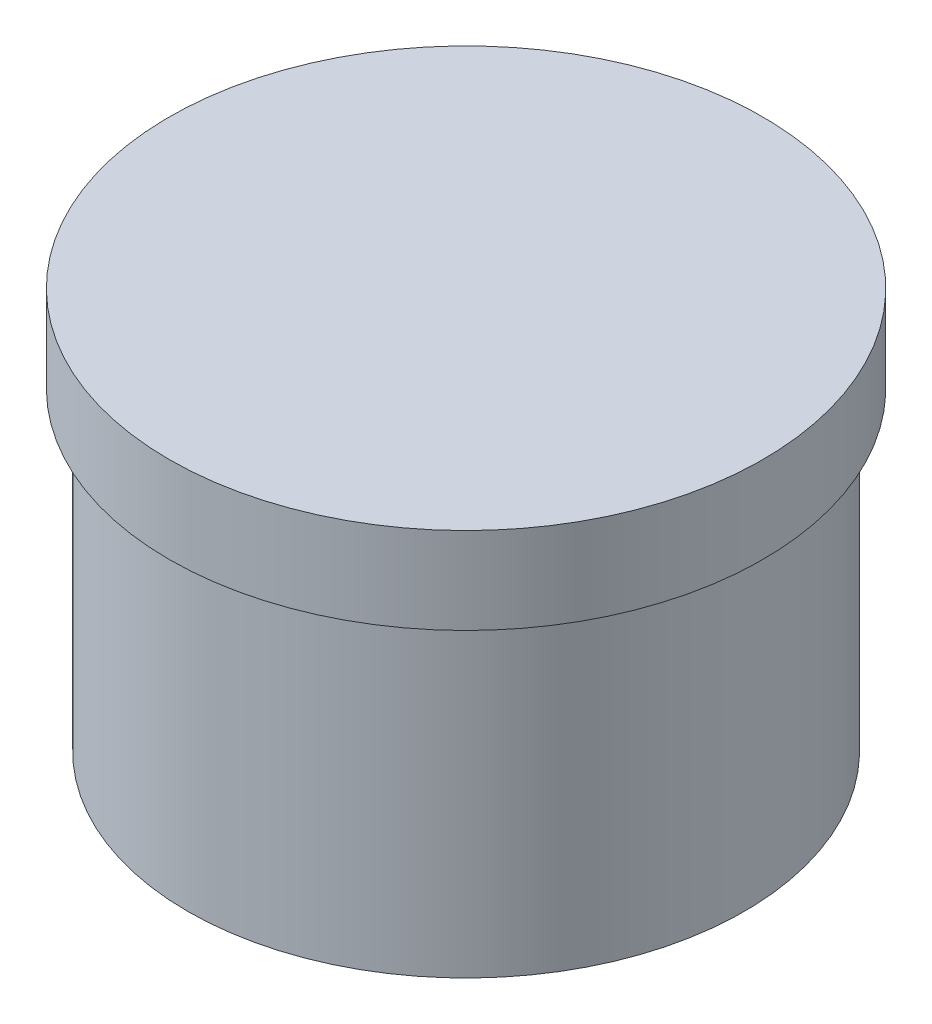
ISO-10303-21;
HEADER;
FILE_DESCRIPTION(('STEP AP214'),'2;1');
FILE_NAME('part.step','',(''),(''),'','','');
FILE_SCHEMA(('AUTOMOTIVE_DESIGN { 1 0 10303 214 1 1 1 1 }'));
ENDSEC;
DATA;
#1=APPLICATION_CONTEXT('core data for automotive mechanical design processes');
#2=APPLICATION_PROTOCOL_DEFINITION('international standard','automotive_design',2000,#1);
#3=PRODUCT_CONTEXT('',#1,'mechanical');
#4=PRODUCT('Part','Part','',(#3));
#5=PRODUCT_RELATED_PRODUCT_CATEGORY('part','',(#4));
#6=PRODUCT_DEFINITION_FORMATION('','',#4);
#7=PRODUCT_DEFINITION_CONTEXT('part definition',#1,'design');
#8=PRODUCT_DEFINITION('design','',#6,#7);
#9=PRODUCT_DEFINITION_SHAPE('','',#8);
#10=(LENGTH_UNIT() NAMED_UNIT(*) SI_UNIT(.MILLI.,.METRE.));
#11=(NAMED_UNIT(*) PLANE_ANGLE_UNIT() SI_UNIT($,.RADIAN.));
#12=(NAMED_UNIT(*) SI_UNIT($,.STERADIAN.) SOLID_ANGLE_UNIT());
#13=UNCERTAINTY_MEASURE_WITH_UNIT(LENGTH_MEASURE(1.E-05),#10,'distance_accuracy_value','');
#14=(GEOMETRIC_REPRESENTATION_CONTEXT(3) GLOBAL_UNCERTAINTY_ASSIGNED_CONTEXT((#13)) GLOBAL_UNIT_ASSIGNED_CONTEXT((#10,
#11,#12)) REPRESENTATION_CONTEXT('',''));
#15=CARTESIAN_POINT('',(0.,0.,0.));
#16=DIRECTION('',(0.,0.,1.));
#17=DIRECTION('',(1.,0.,0.));
#18=AXIS2_PLACEMENT_3D('',#15,#16,#17);
#19=CARTESIAN_POINT('',(0.,-25.4,0.));
#20=DIRECTION('',(0.,1.,0.));
#21=DIRECTION('',(0.,0.,1.));
#22=AXIS2_PLACEMENT_3D('',#19,#20,#21);
#23=CYLINDRICAL_SURFACE('',#22,22.5);
#24=CARTESIAN_POINT('',(0.,-25.4,0.));
#25=DIRECTION('',(0.,1.,0.));
#26=DIRECTION('',(0.,0.,1.));
#27=AXIS2_PLACEMENT_3D('',#24,#25,#26);
#28=CIRCLE('',#27,22.5);
#29=CARTESIAN_POINT('',(0.,-25.4,22.5));
#30=VERTEX_POINT('',#29);
#31=EDGE_CURVE('E10',#30,#30,#28,.T.);
#32=ORIENTED_EDGE('',*,*,#31,.T.);
#33=EDGE_LOOP('',(#32));
#34=FACE_BOUND('',#33,.T.);
#35=CARTESIAN_POINT('',(0.,0.,0.));
#36=DIRECTION('',(0.,1.,0.));
#37=DIRECTION('',(0.,0.,1.));
#38=AXIS2_PLACEMENT_3D('',#35,#36,#37);
#39=CIRCLE('',#38,22.5);
#40=CARTESIAN_POINT('',(0.,0.,22.5));
#41=VERTEX_POINT('',#40);
#42=EDGE_CURVE('E34',#41,#41,#39,.T.);
#43=ORIENTED_EDGE('',*,*,#42,.F.);
#44=EDGE_LOOP('',(#43));
#45=FACE_BOUND('',#44,.T.);
#46=ADVANCED_FACE('F31',(#34,#45),#23,.T.);
#47=CARTESIAN_POINT('',(0.,-25.4,0.));
#48=DIRECTION('',(0.,1.,0.));
#49=DIRECTION('',(0.,0.,1.));
#50=AXIS2_PLACEMENT_3D('',#47,#48,#49);
#51=PLANE('',#50);
#52=ORIENTED_EDGE('',*,*,#31,.F.);
#53=EDGE_LOOP('',(#52));
#54=FACE_BOUND('',#53,.T.);
#55=ADVANCED_FACE('F54',(#54),#51,.F.);
#56=CARTESIAN_POINT('',(0.,7.,0.));
#57=DIRECTION('',(0.,-1.,0.));
#58=DIRECTION('',(0.,0.,-1.));
#59=AXIS2_PLACEMENT_3D('',#56,#57,#58);
#60=CYLINDRICAL_SURFACE('',#59,24.);
#61=CARTESIAN_POINT('',(0.,7.,0.));
#62=DIRECTION('',(0.,1.,0.));
#63=DIRECTION('',(0.,0.,1.));
#64=AXIS2_PLACEMENT_3D('',#61,#62,#63);
#65=CIRCLE('',#64,24.);
#66=CARTESIAN_POINT('',(0.,7.,24.));
#67=VERTEX_POINT('',#66);
#68=EDGE_CURVE('E41',#67,#67,#65,.T.);
#69=ORIENTED_EDGE('',*,*,#68,.F.);
#70=EDGE_LOOP('',(#69));
#71=FACE_BOUND('',#70,.T.);
#72=CARTESIAN_POINT('',(0.,0.,0.));
#73=DIRECTION('',(0.,1.,0.));
#74=DIRECTION('',(0.,0.,1.));
#75=AXIS2_PLACEMENT_3D('',#72,#73,#74);
#76=CIRCLE('',#75,24.);
#77=CARTESIAN_POINT('',(0.,0.,24.));
#78=VERTEX_POINT('',#77);
#79=EDGE_CURVE('E43',#78,#78,#76,.T.);
#80=ORIENTED_EDGE('',*,*,#79,.T.);
#81=EDGE_LOOP('',(#80));
#82=FACE_BOUND('',#81,.T.);
#83=ADVANCED_FACE('F51',(#71,#82),#60,.T.);
#84=CARTESIAN_POINT('',(0.,7.,0.));
#85=DIRECTION('',(0.,1.,0.));
#86=DIRECTION('',(0.,0.,1.));
#87=AXIS2_PLACEMENT_3D('',#84,#85,#86);
#88=PLANE('',#87);
#89=ORIENTED_EDGE('',*,*,#68,.T.);
#90=EDGE_LOOP('',(#89));
#91=FACE_BOUND('',#90,.T.);
#92=ADVANCED_FACE('F49',(#91),#88,.T.);
#93=CARTESIAN_POINT('',(0.,0.,0.));
#94=DIRECTION('',(0.,1.,0.));
#95=DIRECTION('',(0.,0.,1.));
#96=AXIS2_PLACEMENT_3D('',#93,#94,#95);
#97=PLANE('',#96);
#98=ORIENTED_EDGE('',*,*,#42,.T.);
#99=EDGE_LOOP('',(#98));
#100=FACE_BOUND('',#99,.T.);
#101=ORIENTED_EDGE('',*,*,#79,.F.);
#102=EDGE_LOOP('',(#101));
#103=FACE_BOUND('',#102,.T.);
#104=ADVANCED_FACE('F58',(#100,#103),#97,.F.);
#105=CLOSED_SHELL('',(#46,#55,#83,#92,#104));
#106=MANIFOLD_SOLID_BREP('B2',#105);
#107=ADVANCED_BREP_SHAPE_REPRESENTATION('',(#18,#106),#14);
#108=SHAPE_DEFINITION_REPRESENTATION(#9,#107);
ENDSEC;
END-ISO-10303-21;
